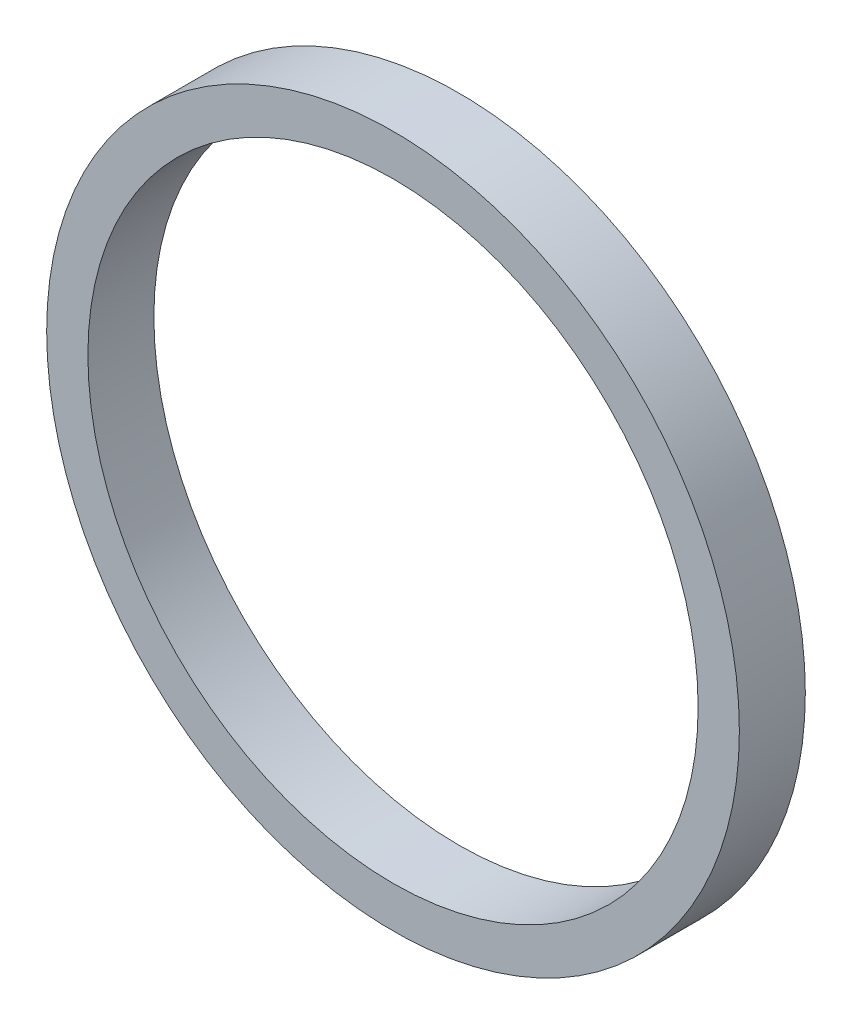
ISO-10303-21;
HEADER;
FILE_DESCRIPTION(('STEP AP214'),'2;1');
FILE_NAME('part.step','',(''),(''),'','','');
FILE_SCHEMA(('AUTOMOTIVE_DESIGN { 1 0 10303 214 1 1 1 1 }'));
ENDSEC;
DATA;
#1=APPLICATION_CONTEXT('core data for automotive mechanical design processes');
#2=APPLICATION_PROTOCOL_DEFINITION('international standard','automotive_design',2000,#1);
#3=PRODUCT_CONTEXT('',#1,'mechanical');
#4=PRODUCT('Part','Part','',(#3));
#5=PRODUCT_RELATED_PRODUCT_CATEGORY('part','',(#4));
#6=PRODUCT_DEFINITION_FORMATION('','',#4);
#7=PRODUCT_DEFINITION_CONTEXT('part definition',#1,'design');
#8=PRODUCT_DEFINITION('design','',#6,#7);
#9=PRODUCT_DEFINITION_SHAPE('','',#8);
#10=(LENGTH_UNIT() NAMED_UNIT(*) SI_UNIT(.MILLI.,.METRE.));
#11=(NAMED_UNIT(*) PLANE_ANGLE_UNIT() SI_UNIT($,.RADIAN.));
#12=(NAMED_UNIT(*) SI_UNIT($,.STERADIAN.) SOLID_ANGLE_UNIT());
#13=UNCERTAINTY_MEASURE_WITH_UNIT(LENGTH_MEASURE(1.E-05),#10,'distance_accuracy_value','');
#14=(GEOMETRIC_REPRESENTATION_CONTEXT(3) GLOBAL_UNCERTAINTY_ASSIGNED_CONTEXT((#13)) GLOBAL_UNIT_ASSIGNED_CONTEXT((#10,
#11,#12)) REPRESENTATION_CONTEXT('',''));
#15=CARTESIAN_POINT('',(0.,0.,0.));
#16=DIRECTION('',(0.,0.,1.));
#17=DIRECTION('',(1.,0.,0.));
#18=AXIS2_PLACEMENT_3D('',#15,#16,#17);
#19=CARTESIAN_POINT('',(0.,0.,0.4));
#20=DIRECTION('',(0.,0.,1.));
#21=DIRECTION('',(1.,0.,0.));
#22=AXIS2_PLACEMENT_3D('',#19,#20,#21);
#23=PLANE('',#22);
#24=CARTESIAN_POINT('',(0.,0.,0.4));
#25=DIRECTION('',(0.,0.,1.));
#26=DIRECTION('',(1.,0.,0.));
#27=AXIS2_PLACEMENT_3D('',#24,#25,#26);
#28=CIRCLE('',#27,2.1);
#29=CARTESIAN_POINT('',(2.1,0.,0.4));
#30=VERTEX_POINT('',#29);
#31=EDGE_CURVE('E10',#30,#30,#28,.T.);
#32=ORIENTED_EDGE('',*,*,#31,.T.);
#33=EDGE_LOOP('',(#32));
#34=FACE_BOUND('',#33,.T.);
#35=CARTESIAN_POINT('',(0.,0.,0.4));
#36=DIRECTION('',(0.,0.,1.));
#37=DIRECTION('',(1.,0.,0.));
#38=AXIS2_PLACEMENT_3D('',#35,#36,#37);
#39=CIRCLE('',#38,1.85);
#40=CARTESIAN_POINT('',(1.85,0.,0.4));
#41=VERTEX_POINT('',#40);
#42=EDGE_CURVE('E42',#41,#41,#39,.T.);
#43=ORIENTED_EDGE('',*,*,#42,.F.);
#44=EDGE_LOOP('',(#43));
#45=FACE_BOUND('',#44,.T.);
#46=ADVANCED_FACE('F31',(#34,#45),#23,.T.);
#47=CARTESIAN_POINT('',(0.,0.,0.));
#48=DIRECTION('',(0.,0.,1.));
#49=DIRECTION('',(1.,0.,0.));
#50=AXIS2_PLACEMENT_3D('',#47,#48,#49);
#51=PLANE('',#50);
#52=CARTESIAN_POINT('',(0.,0.,0.));
#53=DIRECTION('',(0.,0.,1.));
#54=DIRECTION('',(1.,0.,0.));
#55=AXIS2_PLACEMENT_3D('',#52,#53,#54);
#56=CIRCLE('',#55,2.1);
#57=CARTESIAN_POINT('',(2.1,0.,0.));
#58=VERTEX_POINT('',#57);
#59=EDGE_CURVE('E35',#58,#58,#56,.T.);
#60=ORIENTED_EDGE('',*,*,#59,.F.);
#61=EDGE_LOOP('',(#60));
#62=FACE_BOUND('',#61,.T.);
#63=CARTESIAN_POINT('',(0.,0.,0.));
#64=DIRECTION('',(0.,0.,1.));
#65=DIRECTION('',(1.,0.,0.));
#66=AXIS2_PLACEMENT_3D('',#63,#64,#65);
#67=CIRCLE('',#66,1.85);
#68=CARTESIAN_POINT('',(1.85,0.,0.));
#69=VERTEX_POINT('',#68);
#70=EDGE_CURVE('E44',#69,#69,#67,.T.);
#71=ORIENTED_EDGE('',*,*,#70,.T.);
#72=EDGE_LOOP('',(#71));
#73=FACE_BOUND('',#72,.T.);
#74=ADVANCED_FACE('F54',(#62,#73),#51,.F.);
#75=CARTESIAN_POINT('',(0.,0.,0.4));
#76=DIRECTION('',(0.,0.,-1.));
#77=DIRECTION('',(-1.,0.,0.));
#78=AXIS2_PLACEMENT_3D('',#75,#76,#77);
#79=CYLINDRICAL_SURFACE('',#78,2.1);
#80=ORIENTED_EDGE('',*,*,#31,.F.);
#81=EDGE_LOOP('',(#80));
#82=FACE_BOUND('',#81,.T.);
#83=ORIENTED_EDGE('',*,*,#59,.T.);
#84=EDGE_LOOP('',(#83));
#85=FACE_BOUND('',#84,.T.);
#86=ADVANCED_FACE('F33',(#82,#85),#79,.T.);
#87=CARTESIAN_POINT('',(0.,0.,0.4));
#88=DIRECTION('',(0.,0.,-1.));
#89=DIRECTION('',(-1.,0.,0.));
#90=AXIS2_PLACEMENT_3D('',#87,#88,#89);
#91=CYLINDRICAL_SURFACE('',#90,1.85);
#92=ORIENTED_EDGE('',*,*,#42,.T.);
#93=EDGE_LOOP('',(#92));
#94=FACE_BOUND('',#93,.T.);
#95=ORIENTED_EDGE('',*,*,#70,.F.);
#96=EDGE_LOOP('',(#95));
#97=FACE_BOUND('',#96,.T.);
#98=ADVANCED_FACE('F50',(#94,#97),#91,.F.);
#99=CLOSED_SHELL('',(#46,#74,#86,#98));
#100=MANIFOLD_SOLID_BREP('B2',#99);
#101=ADVANCED_BREP_SHAPE_REPRESENTATION('',(#18,#100),#14);
#102=SHAPE_DEFINITION_REPRESENTATION(#9,#101);
ENDSEC;
END-ISO-10303-21;
